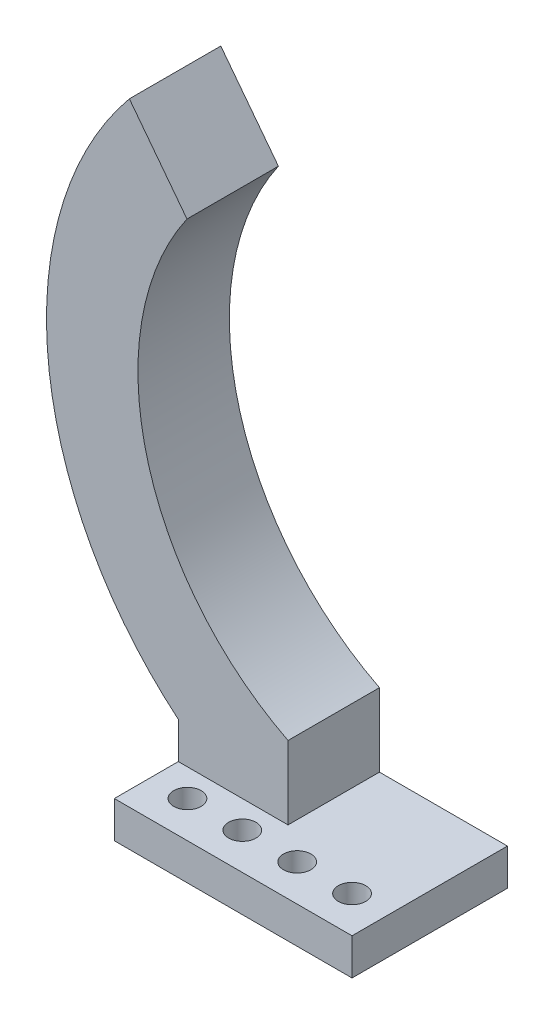
ISO-10303-21;
HEADER;
FILE_DESCRIPTION(('STEP AP214'),'2;1');
FILE_NAME('part.step','',(''),(''),'','','');
FILE_SCHEMA(('AUTOMOTIVE_DESIGN { 1 0 10303 214 1 1 1 1 }'));
ENDSEC;
DATA;
#1=APPLICATION_CONTEXT('core data for automotive mechanical design processes');
#2=APPLICATION_PROTOCOL_DEFINITION('international standard','automotive_design',2000,#1);
#3=PRODUCT_CONTEXT('',#1,'mechanical');
#4=PRODUCT('Part','Part','',(#3));
#5=PRODUCT_RELATED_PRODUCT_CATEGORY('part','',(#4));
#6=PRODUCT_DEFINITION_FORMATION('','',#4);
#7=PRODUCT_DEFINITION_CONTEXT('part definition',#1,'design');
#8=PRODUCT_DEFINITION('design','',#6,#7);
#9=PRODUCT_DEFINITION_SHAPE('','',#8);
#10=(LENGTH_UNIT() NAMED_UNIT(*) SI_UNIT(.MILLI.,.METRE.));
#11=(NAMED_UNIT(*) PLANE_ANGLE_UNIT() SI_UNIT($,.RADIAN.));
#12=(NAMED_UNIT(*) SI_UNIT($,.STERADIAN.) SOLID_ANGLE_UNIT());
#13=UNCERTAINTY_MEASURE_WITH_UNIT(LENGTH_MEASURE(1.E-05),#10,'distance_accuracy_value','');
#14=(GEOMETRIC_REPRESENTATION_CONTEXT(3) GLOBAL_UNCERTAINTY_ASSIGNED_CONTEXT((#13)) GLOBAL_UNIT_ASSIGNED_CONTEXT((#10,
#11,#12)) REPRESENTATION_CONTEXT('',''));
#15=CARTESIAN_POINT('',(0.,0.,0.));
#16=DIRECTION('',(0.,0.,1.));
#17=DIRECTION('',(1.,0.,0.));
#18=AXIS2_PLACEMENT_3D('',#15,#16,#17);
#19=CARTESIAN_POINT('',(27.5604130675414,21.0896959728289,10.));
#20=DIRECTION('',(0.794161935539986,0.607706195574295,0.));
#21=DIRECTION('',(-0.607706195574295,0.794161935539986,0.));
#22=AXIS2_PLACEMENT_3D('',#19,#20,#21);
#23=PLANE('',#22);
#24=DIRECTION('',(0.607706195574295,-0.794161935539986,0.));
#25=VECTOR('',#24,1.);
#26=CARTESIAN_POINT('',(27.5604130675414,21.0896959728289,0.));
#27=LINE('',#26,#25);
#28=CARTESIAN_POINT('',(-5.35401397547057,64.1028909641451,0.));
#29=VERTEX_POINT('',#28);
#30=CARTESIAN_POINT('',(0.947795446687442,55.8675673743047,0.));
#31=VERTEX_POINT('',#30);
#32=EDGE_CURVE('E118',#29,#31,#27,.T.);
#33=ORIENTED_EDGE('',*,*,#32,.F.);
#34=DIRECTION('',(0.,0.,-1.));
#35=VECTOR('',#34,1.);
#36=CARTESIAN_POINT('',(-5.35401397547057,64.1028909641451,10.));
#37=LINE('',#36,#35);
#38=CARTESIAN_POINT('',(-5.35401397547057,64.1028909641451,10.));
#39=VERTEX_POINT('',#38);
#40=EDGE_CURVE('E11',#39,#29,#37,.T.);
#41=ORIENTED_EDGE('',*,*,#40,.F.);
#42=DIRECTION('',(0.607706195574295,-0.794161935539986,0.));
#43=VECTOR('',#42,1.);
#44=CARTESIAN_POINT('',(27.5604130675414,21.0896959728289,10.));
#45=LINE('',#44,#43);
#46=CARTESIAN_POINT('',(0.947795446687442,55.8675673743047,10.));
#47=VERTEX_POINT('',#46);
#48=EDGE_CURVE('E131',#39,#47,#45,.T.);
#49=ORIENTED_EDGE('',*,*,#48,.T.);
#50=DIRECTION('',(0.,0.,-1.));
#51=VECTOR('',#50,1.);
#52=CARTESIAN_POINT('',(0.947795446687442,55.8675673743047,10.));
#53=LINE('',#52,#51);
#54=EDGE_CURVE('E55',#47,#31,#53,.T.);
#55=ORIENTED_EDGE('',*,*,#54,.T.);
#56=EDGE_LOOP('',(#33,#41,#49,#55));
#57=FACE_BOUND('',#56,.T.);
#58=ADVANCED_FACE('F39',(#57),#23,.T.);
#59=CARTESIAN_POINT('',(25.5838541870133,38.7484374389601,10.));
#60=DIRECTION('',(0.,0.,-1.));
#61=DIRECTION('',(-1.,0.,0.));
#62=AXIS2_PLACEMENT_3D('',#59,#60,#61);
#63=CYLINDRICAL_SURFACE('',#62,40.);
#64=CARTESIAN_POINT('',(25.5838541870133,38.7484374389601,0.));
#65=DIRECTION('',(0.,0.,1.));
#66=DIRECTION('',(1.,0.,0.));
#67=AXIS2_PLACEMENT_3D('',#64,#65,#66);
#68=CIRCLE('',#67,40.);
#69=CARTESIAN_POINT('',(0.,8.,0.));
#70=VERTEX_POINT('',#69);
#71=EDGE_CURVE('E120',#29,#70,#68,.T.);
#72=ORIENTED_EDGE('',*,*,#71,.T.);
#73=DIRECTION('',(0.,0.,-1.));
#74=VECTOR('',#73,1.);
#75=CARTESIAN_POINT('',(0.,8.,10.));
#76=LINE('',#75,#74);
#77=CARTESIAN_POINT('',(0.,8.,10.));
#78=VERTEX_POINT('',#77);
#79=EDGE_CURVE('E47',#78,#70,#76,.T.);
#80=ORIENTED_EDGE('',*,*,#79,.F.);
#81=CARTESIAN_POINT('',(25.5838541870133,38.7484374389601,10.));
#82=DIRECTION('',(0.,0.,1.));
#83=DIRECTION('',(1.,0.,0.));
#84=AXIS2_PLACEMENT_3D('',#81,#82,#83);
#85=CIRCLE('',#84,40.);
#86=EDGE_CURVE('E173',#39,#78,#85,.T.);
#87=ORIENTED_EDGE('',*,*,#86,.F.);
#88=ORIENTED_EDGE('',*,*,#40,.T.);
#89=EDGE_LOOP('',(#72,#80,#87,#88));
#90=FACE_BOUND('',#89,.T.);
#91=ADVANCED_FACE('F174',(#90),#63,.T.);
#92=CARTESIAN_POINT('',(0.,0.,10.));
#93=DIRECTION('',(1.,0.,0.));
#94=DIRECTION('',(0.,1.,0.));
#95=AXIS2_PLACEMENT_3D('',#92,#93,#94);
#96=PLANE('',#95);
#97=DIRECTION('',(0.,-1.,0.));
#98=VECTOR('',#97,1.);
#99=CARTESIAN_POINT('',(0.,0.,0.));
#100=LINE('',#99,#98);
#101=CARTESIAN_POINT('',(0.,0.,0.));
#102=VERTEX_POINT('',#101);
#103=EDGE_CURVE('E123',#70,#102,#100,.T.);
#104=ORIENTED_EDGE('',*,*,#103,.T.);
#105=DIRECTION('',(0.,0.,-1.));
#106=VECTOR('',#105,1.);
#107=CARTESIAN_POINT('',(0.,0.,17.));
#108=LINE('',#107,#106);
#109=CARTESIAN_POINT('',(0.,0.,17.));
#110=VERTEX_POINT('',#109);
#111=EDGE_CURVE('E166',#110,#102,#108,.T.);
#112=ORIENTED_EDGE('',*,*,#111,.F.);
#113=DIRECTION('',(0.,1.,0.));
#114=VECTOR('',#113,1.);
#115=CARTESIAN_POINT('',(0.,0.,17.));
#116=LINE('',#115,#114);
#117=CARTESIAN_POINT('',(0.,4.,17.));
#118=VERTEX_POINT('',#117);
#119=EDGE_CURVE('E255',#110,#118,#116,.T.);
#120=ORIENTED_EDGE('',*,*,#119,.T.);
#121=DIRECTION('',(0.,0.,-1.));
#122=VECTOR('',#121,1.);
#123=CARTESIAN_POINT('',(0.,4.,17.));
#124=LINE('',#123,#122);
#125=CARTESIAN_POINT('',(0.,4.,10.));
#126=VERTEX_POINT('',#125);
#127=EDGE_CURVE('E164',#118,#126,#124,.T.);
#128=ORIENTED_EDGE('',*,*,#127,.T.);
#129=DIRECTION('',(0.,-1.,0.));
#130=VECTOR('',#129,1.);
#131=CARTESIAN_POINT('',(0.,0.,10.));
#132=LINE('',#131,#130);
#133=EDGE_CURVE('E110',#78,#126,#132,.T.);
#134=ORIENTED_EDGE('',*,*,#133,.F.);
#135=ORIENTED_EDGE('',*,*,#79,.T.);
#136=EDGE_LOOP('',(#104,#112,#120,#128,#134,#135));
#137=FACE_BOUND('',#136,.T.);
#138=ADVANCED_FACE('F137',(#137),#96,.F.);
#139=CARTESIAN_POINT('',(12.,0.,10.));
#140=DIRECTION('',(1.,0.,0.));
#141=DIRECTION('',(0.,1.,0.));
#142=AXIS2_PLACEMENT_3D('',#139,#140,#141);
#143=PLANE('',#142);
#144=DIRECTION('',(0.,-1.,0.));
#145=VECTOR('',#144,1.);
#146=CARTESIAN_POINT('',(12.,0.,0.));
#147=LINE('',#146,#145);
#148=CARTESIAN_POINT('',(12.,12.,0.));
#149=VERTEX_POINT('',#148);
#150=CARTESIAN_POINT('',(12.,4.,0.));
#151=VERTEX_POINT('',#150);
#152=EDGE_CURVE('E126',#149,#151,#147,.T.);
#153=ORIENTED_EDGE('',*,*,#152,.F.);
#154=DIRECTION('',(0.,0.,-1.));
#155=VECTOR('',#154,1.);
#156=CARTESIAN_POINT('',(12.,12.,10.));
#157=LINE('',#156,#155);
#158=CARTESIAN_POINT('',(12.,12.,10.));
#159=VERTEX_POINT('',#158);
#160=EDGE_CURVE('E69',#159,#149,#157,.T.);
#161=ORIENTED_EDGE('',*,*,#160,.F.);
#162=DIRECTION('',(0.,-1.,0.));
#163=VECTOR('',#162,1.);
#164=CARTESIAN_POINT('',(12.,0.,10.));
#165=LINE('',#164,#163);
#166=CARTESIAN_POINT('',(12.,4.,10.));
#167=VERTEX_POINT('',#166);
#168=EDGE_CURVE('E108',#159,#167,#165,.T.);
#169=ORIENTED_EDGE('',*,*,#168,.T.);
#170=DIRECTION('',(0.,0.,-1.));
#171=VECTOR('',#170,1.);
#172=CARTESIAN_POINT('',(12.,4.,10.));
#173=LINE('',#172,#171);
#174=EDGE_CURVE('E88',#167,#151,#173,.T.);
#175=ORIENTED_EDGE('',*,*,#174,.T.);
#176=EDGE_LOOP('',(#153,#161,#169,#175));
#177=FACE_BOUND('',#176,.T.);
#178=ADVANCED_FACE('F112',(#177),#143,.T.);
#179=CARTESIAN_POINT('',(25.5838541870133,38.7484374389601,10.));
#180=DIRECTION('',(0.,0.,-1.));
#181=DIRECTION('',(-1.,0.,0.));
#182=AXIS2_PLACEMENT_3D('',#179,#180,#181);
#183=CYLINDRICAL_SURFACE('',#182,30.);
#184=CARTESIAN_POINT('',(25.5838541870133,38.7484374389601,0.));
#185=DIRECTION('',(0.,0.,1.));
#186=DIRECTION('',(1.,0.,0.));
#187=AXIS2_PLACEMENT_3D('',#184,#185,#186);
#188=CIRCLE('',#187,30.);
#189=EDGE_CURVE('E128',#31,#149,#188,.T.);
#190=ORIENTED_EDGE('',*,*,#189,.F.);
#191=ORIENTED_EDGE('',*,*,#54,.F.);
#192=CARTESIAN_POINT('',(25.5838541870133,38.7484374389601,10.));
#193=DIRECTION('',(0.,0.,1.));
#194=DIRECTION('',(1.,0.,0.));
#195=AXIS2_PLACEMENT_3D('',#192,#193,#194);
#196=CIRCLE('',#195,30.);
#197=EDGE_CURVE('E113',#47,#159,#196,.T.);
#198=ORIENTED_EDGE('',*,*,#197,.T.);
#199=ORIENTED_EDGE('',*,*,#160,.T.);
#200=EDGE_LOOP('',(#190,#191,#198,#199));
#201=FACE_BOUND('',#200,.T.);
#202=ADVANCED_FACE('F184',(#201),#183,.F.);
#203=CARTESIAN_POINT('',(0.,0.,10.));
#204=DIRECTION('',(0.,0.,1.));
#205=DIRECTION('',(1.,0.,0.));
#206=AXIS2_PLACEMENT_3D('',#203,#204,#205);
#207=PLANE('',#206);
#208=ORIENTED_EDGE('',*,*,#48,.F.);
#209=ORIENTED_EDGE('',*,*,#86,.T.);
#210=ORIENTED_EDGE('',*,*,#133,.T.);
#211=DIRECTION('',(1.,0.,0.));
#212=VECTOR('',#211,1.);
#213=CARTESIAN_POINT('',(0.,4.,10.));
#214=LINE('',#213,#212);
#215=EDGE_CURVE('E92',#126,#167,#214,.T.);
#216=ORIENTED_EDGE('',*,*,#215,.T.);
#217=ORIENTED_EDGE('',*,*,#168,.F.);
#218=ORIENTED_EDGE('',*,*,#197,.F.);
#219=EDGE_LOOP('',(#208,#209,#210,#216,#217,#218));
#220=FACE_BOUND('',#219,.T.);
#221=ADVANCED_FACE('F106',(#220),#207,.T.);
#222=CARTESIAN_POINT('',(0.,0.,0.));
#223=DIRECTION('',(0.,0.,1.));
#224=DIRECTION('',(1.,0.,0.));
#225=AXIS2_PLACEMENT_3D('',#222,#223,#224);
#226=PLANE('',#225);
#227=ORIENTED_EDGE('',*,*,#32,.T.);
#228=ORIENTED_EDGE('',*,*,#189,.T.);
#229=ORIENTED_EDGE('',*,*,#152,.T.);
#230=DIRECTION('',(1.,0.,0.));
#231=VECTOR('',#230,1.);
#232=CARTESIAN_POINT('',(0.,4.,0.));
#233=LINE('',#232,#231);
#234=CARTESIAN_POINT('',(26.,4.,0.));
#235=VERTEX_POINT('',#234);
#236=EDGE_CURVE('E97',#151,#235,#233,.T.);
#237=ORIENTED_EDGE('',*,*,#236,.T.);
#238=DIRECTION('',(0.,-1.,0.));
#239=VECTOR('',#238,1.);
#240=CARTESIAN_POINT('',(26.,4.,0.));
#241=LINE('',#240,#239);
#242=CARTESIAN_POINT('',(26.,0.,0.));
#243=VERTEX_POINT('',#242);
#244=EDGE_CURVE('E151',#235,#243,#241,.T.);
#245=ORIENTED_EDGE('',*,*,#244,.T.);
#246=DIRECTION('',(-1.,0.,0.));
#247=VECTOR('',#246,1.);
#248=CARTESIAN_POINT('',(26.,0.,0.));
#249=LINE('',#248,#247);
#250=EDGE_CURVE('E148',#243,#102,#249,.T.);
#251=ORIENTED_EDGE('',*,*,#250,.T.);
#252=ORIENTED_EDGE('',*,*,#103,.F.);
#253=ORIENTED_EDGE('',*,*,#71,.F.);
#254=EDGE_LOOP('',(#227,#228,#229,#237,#245,#251,#252,#253));
#255=FACE_BOUND('',#254,.T.);
#256=ADVANCED_FACE('F145',(#255),#226,.F.);
#257=CARTESIAN_POINT('',(0.,4.,17.));
#258=DIRECTION('',(0.,1.,0.));
#259=DIRECTION('',(0.,0.,1.));
#260=AXIS2_PLACEMENT_3D('',#257,#258,#259);
#261=PLANE('',#260);
#262=CARTESIAN_POINT('',(4.,4.,13.));
#263=DIRECTION('',(0.,1.,0.));
#264=DIRECTION('',(0.,0.,1.));
#265=AXIS2_PLACEMENT_3D('',#262,#263,#264);
#266=CIRCLE('',#265,1.5);
#267=CARTESIAN_POINT('',(4.,4.,14.5));
#268=VERTEX_POINT('',#267);
#269=EDGE_CURVE('E228',#268,#268,#266,.T.);
#270=ORIENTED_EDGE('',*,*,#269,.F.);
#271=EDGE_LOOP('',(#270));
#272=FACE_BOUND('',#271,.T.);
#273=CARTESIAN_POINT('',(10.,4.,13.));
#274=DIRECTION('',(0.,1.,0.));
#275=DIRECTION('',(0.,0.,1.));
#276=AXIS2_PLACEMENT_3D('',#273,#274,#275);
#277=CIRCLE('',#276,1.5);
#278=CARTESIAN_POINT('',(10.,4.,14.5));
#279=VERTEX_POINT('',#278);
#280=EDGE_CURVE('E229',#279,#279,#277,.T.);
#281=ORIENTED_EDGE('',*,*,#280,.F.);
#282=EDGE_LOOP('',(#281));
#283=FACE_BOUND('',#282,.T.);
#284=CARTESIAN_POINT('',(16.,4.,13.));
#285=DIRECTION('',(0.,1.,0.));
#286=DIRECTION('',(0.,0.,1.));
#287=AXIS2_PLACEMENT_3D('',#284,#285,#286);
#288=CIRCLE('',#287,1.5);
#289=CARTESIAN_POINT('',(16.,4.,14.5));
#290=VERTEX_POINT('',#289);
#291=EDGE_CURVE('E238',#290,#290,#288,.T.);
#292=ORIENTED_EDGE('',*,*,#291,.F.);
#293=EDGE_LOOP('',(#292));
#294=FACE_BOUND('',#293,.T.);
#295=CARTESIAN_POINT('',(22.,4.,13.));
#296=DIRECTION('',(0.,1.,0.));
#297=DIRECTION('',(0.,0.,1.));
#298=AXIS2_PLACEMENT_3D('',#295,#296,#297);
#299=CIRCLE('',#298,1.5);
#300=CARTESIAN_POINT('',(22.,4.,14.5));
#301=VERTEX_POINT('',#300);
#302=EDGE_CURVE('E244',#301,#301,#299,.T.);
#303=ORIENTED_EDGE('',*,*,#302,.F.);
#304=EDGE_LOOP('',(#303));
#305=FACE_BOUND('',#304,.T.);
#306=ORIENTED_EDGE('',*,*,#174,.F.);
#307=ORIENTED_EDGE('',*,*,#215,.F.);
#308=ORIENTED_EDGE('',*,*,#127,.F.);
#309=DIRECTION('',(1.,0.,0.));
#310=VECTOR('',#309,1.);
#311=CARTESIAN_POINT('',(0.,4.,17.));
#312=LINE('',#311,#310);
#313=CARTESIAN_POINT('',(26.,4.,17.));
#314=VERTEX_POINT('',#313);
#315=EDGE_CURVE('E171',#118,#314,#312,.T.);
#316=ORIENTED_EDGE('',*,*,#315,.T.);
#317=DIRECTION('',(0.,0.,-1.));
#318=VECTOR('',#317,1.);
#319=CARTESIAN_POINT('',(26.,4.,17.));
#320=LINE('',#319,#318);
#321=EDGE_CURVE('E121',#314,#235,#320,.T.);
#322=ORIENTED_EDGE('',*,*,#321,.T.);
#323=ORIENTED_EDGE('',*,*,#236,.F.);
#324=EDGE_LOOP('',(#306,#307,#308,#316,#322,#323));
#325=FACE_BOUND('',#324,.T.);
#326=ADVANCED_FACE('F90',(#272,#283,#294,#305,#325),#261,.T.);
#327=CARTESIAN_POINT('',(26.,4.,17.));
#328=DIRECTION('',(1.,0.,0.));
#329=DIRECTION('',(0.,0.,-1.));
#330=AXIS2_PLACEMENT_3D('',#327,#328,#329);
#331=PLANE('',#330);
#332=ORIENTED_EDGE('',*,*,#244,.F.);
#333=ORIENTED_EDGE('',*,*,#321,.F.);
#334=DIRECTION('',(0.,-1.,0.));
#335=VECTOR('',#334,1.);
#336=CARTESIAN_POINT('',(26.,4.,17.));
#337=LINE('',#336,#335);
#338=CARTESIAN_POINT('',(26.,0.,17.));
#339=VERTEX_POINT('',#338);
#340=EDGE_CURVE('E157',#314,#339,#337,.T.);
#341=ORIENTED_EDGE('',*,*,#340,.T.);
#342=DIRECTION('',(0.,0.,-1.));
#343=VECTOR('',#342,1.);
#344=CARTESIAN_POINT('',(26.,0.,17.));
#345=LINE('',#344,#343);
#346=EDGE_CURVE('E168',#339,#243,#345,.T.);
#347=ORIENTED_EDGE('',*,*,#346,.T.);
#348=EDGE_LOOP('',(#332,#333,#341,#347));
#349=FACE_BOUND('',#348,.T.);
#350=ADVANCED_FACE('F191',(#349),#331,.T.);
#351=CARTESIAN_POINT('',(26.,0.,17.));
#352=DIRECTION('',(0.,-1.,0.));
#353=DIRECTION('',(1.,0.,0.));
#354=AXIS2_PLACEMENT_3D('',#351,#352,#353);
#355=PLANE('',#354);
#356=CARTESIAN_POINT('',(4.,0.,13.));
#357=DIRECTION('',(0.,1.,0.));
#358=DIRECTION('',(0.,0.,1.));
#359=AXIS2_PLACEMENT_3D('',#356,#357,#358);
#360=CIRCLE('',#359,1.5);
#361=CARTESIAN_POINT('',(4.,0.,14.5));
#362=VERTEX_POINT('',#361);
#363=EDGE_CURVE('E159',#362,#362,#360,.T.);
#364=ORIENTED_EDGE('',*,*,#363,.T.);
#365=EDGE_LOOP('',(#364));
#366=FACE_BOUND('',#365,.T.);
#367=CARTESIAN_POINT('',(10.,0.,13.));
#368=DIRECTION('',(0.,1.,0.));
#369=DIRECTION('',(0.,0.,1.));
#370=AXIS2_PLACEMENT_3D('',#367,#368,#369);
#371=CIRCLE('',#370,1.5);
#372=CARTESIAN_POINT('',(10.,0.,14.5));
#373=VERTEX_POINT('',#372);
#374=EDGE_CURVE('E233',#373,#373,#371,.T.);
#375=ORIENTED_EDGE('',*,*,#374,.T.);
#376=EDGE_LOOP('',(#375));
#377=FACE_BOUND('',#376,.T.);
#378=CARTESIAN_POINT('',(16.,0.,13.));
#379=DIRECTION('',(0.,1.,0.));
#380=DIRECTION('',(0.,0.,1.));
#381=AXIS2_PLACEMENT_3D('',#378,#379,#380);
#382=CIRCLE('',#381,1.5);
#383=CARTESIAN_POINT('',(16.,0.,14.5));
#384=VERTEX_POINT('',#383);
#385=EDGE_CURVE('E241',#384,#384,#382,.T.);
#386=ORIENTED_EDGE('',*,*,#385,.T.);
#387=EDGE_LOOP('',(#386));
#388=FACE_BOUND('',#387,.T.);
#389=CARTESIAN_POINT('',(22.,0.,13.));
#390=DIRECTION('',(0.,1.,0.));
#391=DIRECTION('',(0.,0.,1.));
#392=AXIS2_PLACEMENT_3D('',#389,#390,#391);
#393=CIRCLE('',#392,1.5);
#394=CARTESIAN_POINT('',(22.,0.,14.5));
#395=VERTEX_POINT('',#394);
#396=EDGE_CURVE('E247',#395,#395,#393,.T.);
#397=ORIENTED_EDGE('',*,*,#396,.T.);
#398=EDGE_LOOP('',(#397));
#399=FACE_BOUND('',#398,.T.);
#400=ORIENTED_EDGE('',*,*,#250,.F.);
#401=ORIENTED_EDGE('',*,*,#346,.F.);
#402=DIRECTION('',(-1.,0.,0.));
#403=VECTOR('',#402,1.);
#404=CARTESIAN_POINT('',(26.,0.,17.));
#405=LINE('',#404,#403);
#406=EDGE_CURVE('E252',#339,#110,#405,.T.);
#407=ORIENTED_EDGE('',*,*,#406,.T.);
#408=ORIENTED_EDGE('',*,*,#111,.T.);
#409=EDGE_LOOP('',(#400,#401,#407,#408));
#410=FACE_BOUND('',#409,.T.);
#411=ADVANCED_FACE('F194',(#366,#377,#388,#399,#410),#355,.T.);
#412=CARTESIAN_POINT('',(0.,0.,17.));
#413=DIRECTION('',(0.,0.,-1.));
#414=DIRECTION('',(-1.,0.,0.));
#415=AXIS2_PLACEMENT_3D('',#412,#413,#414);
#416=PLANE('',#415);
#417=ORIENTED_EDGE('',*,*,#340,.F.);
#418=ORIENTED_EDGE('',*,*,#315,.F.);
#419=ORIENTED_EDGE('',*,*,#119,.F.);
#420=ORIENTED_EDGE('',*,*,#406,.F.);
#421=EDGE_LOOP('',(#417,#418,#419,#420));
#422=FACE_BOUND('',#421,.T.);
#423=ADVANCED_FACE('F198',(#422),#416,.F.);
#424=CARTESIAN_POINT('',(22.,0.,13.));
#425=DIRECTION('',(0.,1.,0.));
#426=DIRECTION('',(0.,0.,1.));
#427=AXIS2_PLACEMENT_3D('',#424,#425,#426);
#428=CYLINDRICAL_SURFACE('',#427,1.5);
#429=ORIENTED_EDGE('',*,*,#396,.F.);
#430=EDGE_LOOP('',(#429));
#431=FACE_BOUND('',#430,.T.);
#432=ORIENTED_EDGE('',*,*,#302,.T.);
#433=EDGE_LOOP('',(#432));
#434=FACE_BOUND('',#433,.T.);
#435=ADVANCED_FACE('F205',(#431,#434),#428,.F.);
#436=CARTESIAN_POINT('',(16.,0.,13.));
#437=DIRECTION('',(0.,1.,0.));
#438=DIRECTION('',(0.,0.,1.));
#439=AXIS2_PLACEMENT_3D('',#436,#437,#438);
#440=CYLINDRICAL_SURFACE('',#439,1.5);
#441=ORIENTED_EDGE('',*,*,#385,.F.);
#442=EDGE_LOOP('',(#441));
#443=FACE_BOUND('',#442,.T.);
#444=ORIENTED_EDGE('',*,*,#291,.T.);
#445=EDGE_LOOP('',(#444));
#446=FACE_BOUND('',#445,.T.);
#447=ADVANCED_FACE('F209',(#443,#446),#440,.F.);
#448=CARTESIAN_POINT('',(10.,0.,13.));
#449=DIRECTION('',(0.,1.,0.));
#450=DIRECTION('',(0.,0.,1.));
#451=AXIS2_PLACEMENT_3D('',#448,#449,#450);
#452=CYLINDRICAL_SURFACE('',#451,1.5);
#453=ORIENTED_EDGE('',*,*,#374,.F.);
#454=EDGE_LOOP('',(#453));
#455=FACE_BOUND('',#454,.T.);
#456=ORIENTED_EDGE('',*,*,#280,.T.);
#457=EDGE_LOOP('',(#456));
#458=FACE_BOUND('',#457,.T.);
#459=ADVANCED_FACE('F213',(#455,#458),#452,.F.);
#460=CARTESIAN_POINT('',(4.,0.,13.));
#461=DIRECTION('',(0.,1.,0.));
#462=DIRECTION('',(0.,0.,1.));
#463=AXIS2_PLACEMENT_3D('',#460,#461,#462);
#464=CYLINDRICAL_SURFACE('',#463,1.5);
#465=ORIENTED_EDGE('',*,*,#363,.F.);
#466=EDGE_LOOP('',(#465));
#467=FACE_BOUND('',#466,.T.);
#468=ORIENTED_EDGE('',*,*,#269,.T.);
#469=EDGE_LOOP('',(#468));
#470=FACE_BOUND('',#469,.T.);
#471=ADVANCED_FACE('F217',(#467,#470),#464,.F.);
#472=CLOSED_SHELL('',(#58,#91,#138,#178,#202,#221,#256,#326,#350,#411,#423,#435,#447,#459,#471));
#473=MANIFOLD_SOLID_BREP('B2',#472);
#474=ADVANCED_BREP_SHAPE_REPRESENTATION('',(#18,#473),#14);
#475=SHAPE_DEFINITION_REPRESENTATION(#9,#474);
ENDSEC;
END-ISO-10303-21;
